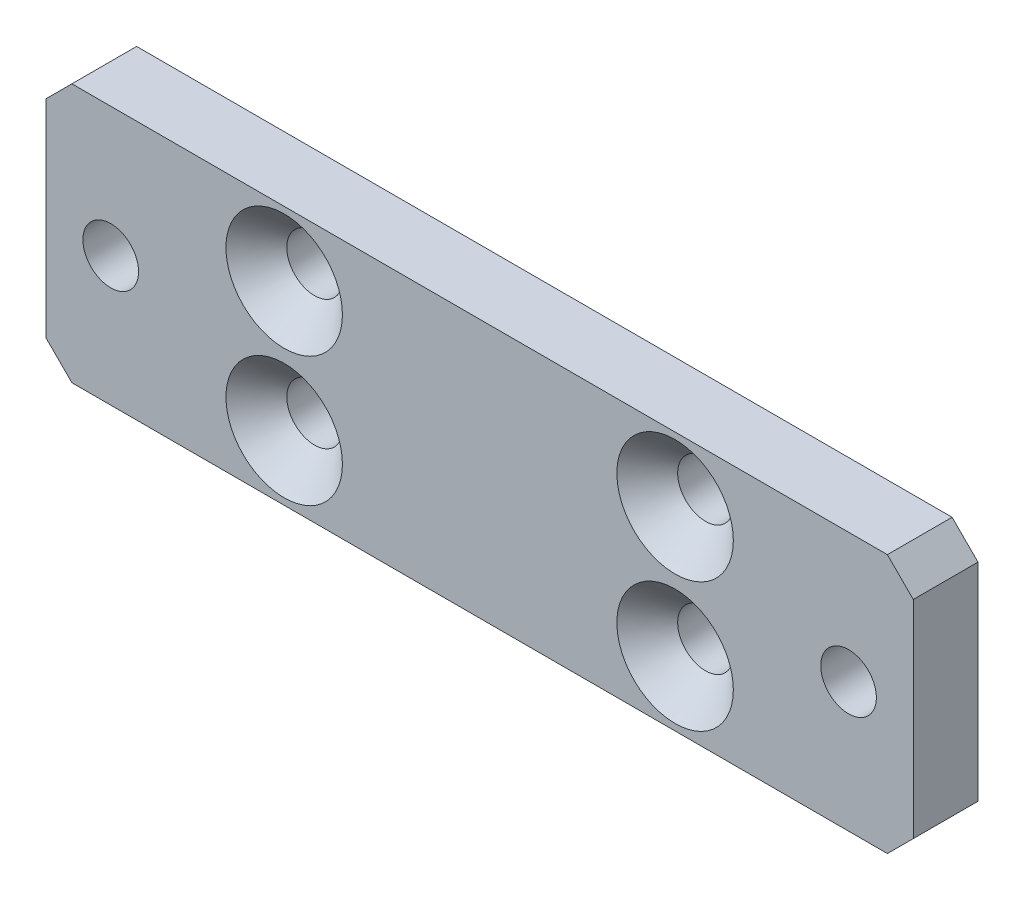
ISO-10303-21;
HEADER;
FILE_DESCRIPTION(('STEP AP214'),'2;1');
FILE_NAME('part.step','',(''),(''),'','','');
FILE_SCHEMA(('AUTOMOTIVE_DESIGN { 1 0 10303 214 1 1 1 1 }'));
ENDSEC;
DATA;
#1=APPLICATION_CONTEXT('core data for automotive mechanical design processes');
#2=APPLICATION_PROTOCOL_DEFINITION('international standard','automotive_design',2000,#1);
#3=PRODUCT_CONTEXT('',#1,'mechanical');
#4=PRODUCT('Part','Part','',(#3));
#5=PRODUCT_RELATED_PRODUCT_CATEGORY('part','',(#4));
#6=PRODUCT_DEFINITION_FORMATION('','',#4);
#7=PRODUCT_DEFINITION_CONTEXT('part definition',#1,'design');
#8=PRODUCT_DEFINITION('design','',#6,#7);
#9=PRODUCT_DEFINITION_SHAPE('','',#8);
#10=(LENGTH_UNIT() NAMED_UNIT(*) SI_UNIT(.MILLI.,.METRE.));
#11=(NAMED_UNIT(*) PLANE_ANGLE_UNIT() SI_UNIT($,.RADIAN.));
#12=(NAMED_UNIT(*) SI_UNIT($,.STERADIAN.) SOLID_ANGLE_UNIT());
#13=UNCERTAINTY_MEASURE_WITH_UNIT(LENGTH_MEASURE(1.E-05),#10,'distance_accuracy_value','');
#14=(GEOMETRIC_REPRESENTATION_CONTEXT(3) GLOBAL_UNCERTAINTY_ASSIGNED_CONTEXT((#13)) GLOBAL_UNIT_ASSIGNED_CONTEXT((#10,
#11,#12)) REPRESENTATION_CONTEXT('',''));
#15=CARTESIAN_POINT('',(0.,0.,0.));
#16=DIRECTION('',(0.,0.,1.));
#17=DIRECTION('',(1.,0.,0.));
#18=AXIS2_PLACEMENT_3D('',#15,#16,#17);
#19=CARTESIAN_POINT('',(-33.5,-10.,2.5));
#20=DIRECTION('',(1.,0.,0.));
#21=DIRECTION('',(0.,1.,0.));
#22=AXIS2_PLACEMENT_3D('',#19,#20,#21);
#23=PLANE('',#22);
#24=DIRECTION('',(0.,-1.,0.));
#25=VECTOR('',#24,1.);
#26=CARTESIAN_POINT('',(-33.5,-10.,-2.5));
#27=LINE('',#26,#25);
#28=CARTESIAN_POINT('',(-33.5,7.99999999999999,-2.5));
#29=VERTEX_POINT('',#28);
#30=CARTESIAN_POINT('',(-33.5,-8.00000000000001,-2.5));
#31=VERTEX_POINT('',#30);
#32=EDGE_CURVE('E169',#29,#31,#27,.T.);
#33=ORIENTED_EDGE('',*,*,#32,.T.);
#34=DIRECTION('',(0.,0.,1.));
#35=VECTOR('',#34,1.);
#36=CARTESIAN_POINT('',(-33.5,-8.00000000000001,2.5));
#37=LINE('',#36,#35);
#38=CARTESIAN_POINT('',(-33.5,-8.00000000000001,2.5));
#39=VERTEX_POINT('',#38);
#40=EDGE_CURVE('E144',#31,#39,#37,.T.);
#41=ORIENTED_EDGE('',*,*,#40,.T.);
#42=DIRECTION('',(0.,-1.,0.));
#43=VECTOR('',#42,1.);
#44=CARTESIAN_POINT('',(-33.5,-10.,2.5));
#45=LINE('',#44,#43);
#46=CARTESIAN_POINT('',(-33.5,7.99999999999999,2.5));
#47=VERTEX_POINT('',#46);
#48=EDGE_CURVE('E184',#47,#39,#45,.T.);
#49=ORIENTED_EDGE('',*,*,#48,.F.);
#50=DIRECTION('',(0.,0.,-1.));
#51=VECTOR('',#50,1.);
#52=CARTESIAN_POINT('',(-33.5,7.99999999999999,2.5));
#53=LINE('',#52,#51);
#54=EDGE_CURVE('E150',#47,#29,#53,.T.);
#55=ORIENTED_EDGE('',*,*,#54,.T.);
#56=EDGE_LOOP('',(#33,#41,#49,#55));
#57=FACE_BOUND('',#56,.T.);
#58=ADVANCED_FACE('F56',(#57),#23,.F.);
#59=CARTESIAN_POINT('',(33.5,-10.,2.5));
#60=DIRECTION('',(0.,1.,0.));
#61=DIRECTION('',(-1.,0.,0.));
#62=AXIS2_PLACEMENT_3D('',#59,#60,#61);
#63=PLANE('',#62);
#64=DIRECTION('',(1.,0.,0.));
#65=VECTOR('',#64,1.);
#66=CARTESIAN_POINT('',(33.5,-10.,2.5));
#67=LINE('',#66,#65);
#68=CARTESIAN_POINT('',(-31.5,-10.,2.5));
#69=VERTEX_POINT('',#68);
#70=CARTESIAN_POINT('',(31.5,-10.,2.5));
#71=VERTEX_POINT('',#70);
#72=EDGE_CURVE('E160',#69,#71,#67,.T.);
#73=ORIENTED_EDGE('',*,*,#72,.F.);
#74=DIRECTION('',(0.,0.,-1.));
#75=VECTOR('',#74,1.);
#76=CARTESIAN_POINT('',(-31.5,-10.,2.5));
#77=LINE('',#76,#75);
#78=CARTESIAN_POINT('',(-31.5,-10.,-2.5));
#79=VERTEX_POINT('',#78);
#80=EDGE_CURVE('E143',#69,#79,#77,.T.);
#81=ORIENTED_EDGE('',*,*,#80,.T.);
#82=DIRECTION('',(1.,0.,0.));
#83=VECTOR('',#82,1.);
#84=CARTESIAN_POINT('',(33.5,-10.,-2.5));
#85=LINE('',#84,#83);
#86=CARTESIAN_POINT('',(31.5,-10.,-2.5));
#87=VERTEX_POINT('',#86);
#88=EDGE_CURVE('E157',#79,#87,#85,.T.);
#89=ORIENTED_EDGE('',*,*,#88,.T.);
#90=DIRECTION('',(0.,0.,1.));
#91=VECTOR('',#90,1.);
#92=CARTESIAN_POINT('',(31.5,-10.,2.5));
#93=LINE('',#92,#91);
#94=EDGE_CURVE('E163',#87,#71,#93,.T.);
#95=ORIENTED_EDGE('',*,*,#94,.T.);
#96=EDGE_LOOP('',(#73,#81,#89,#95));
#97=FACE_BOUND('',#96,.T.);
#98=ADVANCED_FACE('F156',(#97),#63,.F.);
#99=CARTESIAN_POINT('',(33.5,-10.,2.5));
#100=DIRECTION('',(-1.,0.,0.));
#101=DIRECTION('',(0.,0.,1.));
#102=AXIS2_PLACEMENT_3D('',#99,#100,#101);
#103=PLANE('',#102);
#104=DIRECTION('',(0.,1.,0.));
#105=VECTOR('',#104,1.);
#106=CARTESIAN_POINT('',(33.5,-10.,2.5));
#107=LINE('',#106,#105);
#108=CARTESIAN_POINT('',(33.5,-7.99999999999999,2.5));
#109=VERTEX_POINT('',#108);
#110=CARTESIAN_POINT('',(33.5,8.00000000000001,2.5));
#111=VERTEX_POINT('',#110);
#112=EDGE_CURVE('E276',#109,#111,#107,.T.);
#113=ORIENTED_EDGE('',*,*,#112,.F.);
#114=DIRECTION('',(0.,0.,-1.));
#115=VECTOR('',#114,1.);
#116=CARTESIAN_POINT('',(33.5,-7.99999999999999,2.5));
#117=LINE('',#116,#115);
#118=CARTESIAN_POINT('',(33.5,-7.99999999999999,-2.5));
#119=VERTEX_POINT('',#118);
#120=EDGE_CURVE('E214',#109,#119,#117,.T.);
#121=ORIENTED_EDGE('',*,*,#120,.T.);
#122=DIRECTION('',(0.,1.,0.));
#123=VECTOR('',#122,1.);
#124=CARTESIAN_POINT('',(33.5,-10.,-2.5));
#125=LINE('',#124,#123);
#126=CARTESIAN_POINT('',(33.5,8.00000000000001,-2.5));
#127=VERTEX_POINT('',#126);
#128=EDGE_CURVE('E168',#119,#127,#125,.T.);
#129=ORIENTED_EDGE('',*,*,#128,.T.);
#130=DIRECTION('',(0.,0.,1.));
#131=VECTOR('',#130,1.);
#132=CARTESIAN_POINT('',(33.5,8.00000000000001,2.5));
#133=LINE('',#132,#131);
#134=EDGE_CURVE('E211',#127,#111,#133,.T.);
#135=ORIENTED_EDGE('',*,*,#134,.T.);
#136=EDGE_LOOP('',(#113,#121,#129,#135));
#137=FACE_BOUND('',#136,.T.);
#138=ADVANCED_FACE('F357',(#137),#103,.F.);
#139=CARTESIAN_POINT('',(33.5,10.,2.5));
#140=DIRECTION('',(0.,-1.,0.));
#141=DIRECTION('',(1.,0.,0.));
#142=AXIS2_PLACEMENT_3D('',#139,#140,#141);
#143=PLANE('',#142);
#144=DIRECTION('',(-1.,0.,0.));
#145=VECTOR('',#144,1.);
#146=CARTESIAN_POINT('',(33.5,10.,2.5));
#147=LINE('',#146,#145);
#148=CARTESIAN_POINT('',(31.5,10.,2.5));
#149=VERTEX_POINT('',#148);
#150=CARTESIAN_POINT('',(-31.5,9.99999999999999,2.5));
#151=VERTEX_POINT('',#150);
#152=EDGE_CURVE('E186',#149,#151,#147,.T.);
#153=ORIENTED_EDGE('',*,*,#152,.F.);
#154=DIRECTION('',(0.,0.,-1.));
#155=VECTOR('',#154,1.);
#156=CARTESIAN_POINT('',(31.5,10.,2.5));
#157=LINE('',#156,#155);
#158=CARTESIAN_POINT('',(31.5,10.,-2.5));
#159=VERTEX_POINT('',#158);
#160=EDGE_CURVE('E13',#149,#159,#157,.T.);
#161=ORIENTED_EDGE('',*,*,#160,.T.);
#162=DIRECTION('',(-1.,0.,0.));
#163=VECTOR('',#162,1.);
#164=CARTESIAN_POINT('',(33.5,10.,-2.5));
#165=LINE('',#164,#163);
#166=CARTESIAN_POINT('',(-31.5,9.99999999999999,-2.5));
#167=VERTEX_POINT('',#166);
#168=EDGE_CURVE('E176',#159,#167,#165,.T.);
#169=ORIENTED_EDGE('',*,*,#168,.T.);
#170=DIRECTION('',(0.,0.,1.));
#171=VECTOR('',#170,1.);
#172=CARTESIAN_POINT('',(-31.5,9.99999999999999,2.5));
#173=LINE('',#172,#171);
#174=EDGE_CURVE('E65',#167,#151,#173,.T.);
#175=ORIENTED_EDGE('',*,*,#174,.T.);
#176=EDGE_LOOP('',(#153,#161,#169,#175));
#177=FACE_BOUND('',#176,.T.);
#178=ADVANCED_FACE('F342',(#177),#143,.F.);
#179=CARTESIAN_POINT('',(0.,0.,2.5));
#180=DIRECTION('',(0.,0.,1.));
#181=DIRECTION('',(1.,0.,0.));
#182=AXIS2_PLACEMENT_3D('',#179,#180,#181);
#183=PLANE('',#182);
#184=CARTESIAN_POINT('',(-15.1,-5.,2.5));
#185=DIRECTION('',(0.,0.,1.));
#186=DIRECTION('',(1.,0.,0.));
#187=AXIS2_PLACEMENT_3D('',#184,#185,#186);
#188=CIRCLE('',#187,4.5);
#189=CARTESIAN_POINT('',(-10.6,-5.,2.5));
#190=VERTEX_POINT('',#189);
#191=EDGE_CURVE('E289',#190,#190,#188,.T.);
#192=ORIENTED_EDGE('',*,*,#191,.F.);
#193=EDGE_LOOP('',(#192));
#194=FACE_BOUND('',#193,.T.);
#195=CARTESIAN_POINT('',(-15.1,5.,2.5));
#196=DIRECTION('',(0.,0.,1.));
#197=DIRECTION('',(1.,0.,0.));
#198=AXIS2_PLACEMENT_3D('',#195,#196,#197);
#199=CIRCLE('',#198,4.5);
#200=CARTESIAN_POINT('',(-10.6,5.,2.5));
#201=VERTEX_POINT('',#200);
#202=EDGE_CURVE('E260',#201,#201,#199,.T.);
#203=ORIENTED_EDGE('',*,*,#202,.F.);
#204=EDGE_LOOP('',(#203));
#205=FACE_BOUND('',#204,.T.);
#206=CARTESIAN_POINT('',(15.1,5.,2.5));
#207=DIRECTION('',(0.,0.,1.));
#208=DIRECTION('',(1.,0.,0.));
#209=AXIS2_PLACEMENT_3D('',#206,#207,#208);
#210=CIRCLE('',#209,4.5);
#211=CARTESIAN_POINT('',(19.6,5.,2.5));
#212=VERTEX_POINT('',#211);
#213=EDGE_CURVE('E273',#212,#212,#210,.T.);
#214=ORIENTED_EDGE('',*,*,#213,.F.);
#215=EDGE_LOOP('',(#214));
#216=FACE_BOUND('',#215,.T.);
#217=CARTESIAN_POINT('',(15.1,-5.,2.5));
#218=DIRECTION('',(0.,0.,1.));
#219=DIRECTION('',(1.,0.,0.));
#220=AXIS2_PLACEMENT_3D('',#217,#218,#219);
#221=CIRCLE('',#220,4.5);
#222=CARTESIAN_POINT('',(19.6,-5.,2.5));
#223=VERTEX_POINT('',#222);
#224=EDGE_CURVE('E232',#223,#223,#221,.T.);
#225=ORIENTED_EDGE('',*,*,#224,.F.);
#226=EDGE_LOOP('',(#225));
#227=FACE_BOUND('',#226,.T.);
#228=CARTESIAN_POINT('',(-28.5,0.,2.5));
#229=DIRECTION('',(0.,0.,1.));
#230=DIRECTION('',(1.,0.,0.));
#231=AXIS2_PLACEMENT_3D('',#228,#229,#230);
#232=CIRCLE('',#231,2.14999999999999);
#233=CARTESIAN_POINT('',(-26.35,0.,2.5));
#234=VERTEX_POINT('',#233);
#235=EDGE_CURVE('E251',#234,#234,#232,.T.);
#236=ORIENTED_EDGE('',*,*,#235,.F.);
#237=EDGE_LOOP('',(#236));
#238=FACE_BOUND('',#237,.T.);
#239=CARTESIAN_POINT('',(28.5,0.,2.5));
#240=DIRECTION('',(0.,0.,1.));
#241=DIRECTION('',(1.,0.,0.));
#242=AXIS2_PLACEMENT_3D('',#239,#240,#241);
#243=CIRCLE('',#242,2.14999999999999);
#244=CARTESIAN_POINT('',(30.65,0.,2.5));
#245=VERTEX_POINT('',#244);
#246=EDGE_CURVE('E250',#245,#245,#243,.T.);
#247=ORIENTED_EDGE('',*,*,#246,.F.);
#248=EDGE_LOOP('',(#247));
#249=FACE_BOUND('',#248,.T.);
#250=ORIENTED_EDGE('',*,*,#48,.T.);
#251=DIRECTION('',(-0.707106781186548,0.707106781186548,0.));
#252=VECTOR('',#251,1.);
#253=CARTESIAN_POINT('',(-20.75,-20.75,2.5));
#254=LINE('',#253,#252);
#255=EDGE_CURVE('E208',#39,#69,#254,.F.);
#256=ORIENTED_EDGE('',*,*,#255,.T.);
#257=ORIENTED_EDGE('',*,*,#72,.T.);
#258=DIRECTION('',(-0.707106781186549,-0.707106781186546,0.));
#259=VECTOR('',#258,1.);
#260=CARTESIAN_POINT('',(20.7499999999999,-20.75,2.5));
#261=LINE('',#260,#259);
#262=EDGE_CURVE('E205',#71,#109,#261,.F.);
#263=ORIENTED_EDGE('',*,*,#262,.T.);
#264=ORIENTED_EDGE('',*,*,#112,.T.);
#265=DIRECTION('',(0.707106781186548,-0.707106781186548,0.));
#266=VECTOR('',#265,1.);
#267=CARTESIAN_POINT('',(20.75,20.75,2.5));
#268=LINE('',#267,#266);
#269=EDGE_CURVE('E84',#111,#149,#268,.F.);
#270=ORIENTED_EDGE('',*,*,#269,.T.);
#271=ORIENTED_EDGE('',*,*,#152,.T.);
#272=DIRECTION('',(0.707106781186549,0.707106781186546,0.));
#273=VECTOR('',#272,1.);
#274=CARTESIAN_POINT('',(-20.7499999999999,20.75,2.5));
#275=LINE('',#274,#273);
#276=EDGE_CURVE('E200',#151,#47,#275,.F.);
#277=ORIENTED_EDGE('',*,*,#276,.T.);
#278=EDGE_LOOP('',(#250,#256,#257,#263,#264,#270,#271,#277));
#279=FACE_BOUND('',#278,.T.);
#280=ADVANCED_FACE('F340',(#194,#205,#216,#227,#238,#249,#279),#183,.T.);
#281=CARTESIAN_POINT('',(0.,0.,-2.5));
#282=DIRECTION('',(0.,0.,1.));
#283=DIRECTION('',(1.,0.,0.));
#284=AXIS2_PLACEMENT_3D('',#281,#282,#283);
#285=PLANE('',#284);
#286=CARTESIAN_POINT('',(-15.1,-5.,-2.5));
#287=DIRECTION('',(0.,0.,1.));
#288=DIRECTION('',(1.,0.,0.));
#289=AXIS2_PLACEMENT_3D('',#286,#287,#288);
#290=CIRCLE('',#289,2.15);
#291=CARTESIAN_POINT('',(-12.95,-5.,-2.5));
#292=VERTEX_POINT('',#291);
#293=EDGE_CURVE('E288',#292,#292,#290,.T.);
#294=ORIENTED_EDGE('',*,*,#293,.T.);
#295=EDGE_LOOP('',(#294));
#296=FACE_BOUND('',#295,.T.);
#297=CARTESIAN_POINT('',(-15.1,5.,-2.5));
#298=DIRECTION('',(0.,0.,1.));
#299=DIRECTION('',(1.,0.,0.));
#300=AXIS2_PLACEMENT_3D('',#297,#298,#299);
#301=CIRCLE('',#300,2.15);
#302=CARTESIAN_POINT('',(-12.95,5.,-2.5));
#303=VERTEX_POINT('',#302);
#304=EDGE_CURVE('E259',#303,#303,#301,.T.);
#305=ORIENTED_EDGE('',*,*,#304,.T.);
#306=EDGE_LOOP('',(#305));
#307=FACE_BOUND('',#306,.T.);
#308=CARTESIAN_POINT('',(15.1,5.,-2.5));
#309=DIRECTION('',(0.,0.,1.));
#310=DIRECTION('',(1.,0.,0.));
#311=AXIS2_PLACEMENT_3D('',#308,#309,#310);
#312=CIRCLE('',#311,2.15);
#313=CARTESIAN_POINT('',(17.25,5.,-2.5));
#314=VERTEX_POINT('',#313);
#315=EDGE_CURVE('E229',#314,#314,#312,.T.);
#316=ORIENTED_EDGE('',*,*,#315,.T.);
#317=EDGE_LOOP('',(#316));
#318=FACE_BOUND('',#317,.T.);
#319=CARTESIAN_POINT('',(15.1,-5.,-2.5));
#320=DIRECTION('',(0.,0.,1.));
#321=DIRECTION('',(1.,0.,0.));
#322=AXIS2_PLACEMENT_3D('',#319,#320,#321);
#323=CIRCLE('',#322,2.15);
#324=CARTESIAN_POINT('',(17.25,-5.,-2.5));
#325=VERTEX_POINT('',#324);
#326=EDGE_CURVE('E293',#325,#325,#323,.T.);
#327=ORIENTED_EDGE('',*,*,#326,.T.);
#328=EDGE_LOOP('',(#327));
#329=FACE_BOUND('',#328,.T.);
#330=CARTESIAN_POINT('',(-28.5,0.,-2.5));
#331=DIRECTION('',(0.,0.,1.));
#332=DIRECTION('',(1.,0.,0.));
#333=AXIS2_PLACEMENT_3D('',#330,#331,#332);
#334=CIRCLE('',#333,2.15);
#335=CARTESIAN_POINT('',(-26.35,0.,-2.5));
#336=VERTEX_POINT('',#335);
#337=EDGE_CURVE('E246',#336,#336,#334,.T.);
#338=ORIENTED_EDGE('',*,*,#337,.T.);
#339=EDGE_LOOP('',(#338));
#340=FACE_BOUND('',#339,.T.);
#341=CARTESIAN_POINT('',(28.5,0.,-2.5));
#342=DIRECTION('',(0.,0.,1.));
#343=DIRECTION('',(1.,0.,0.));
#344=AXIS2_PLACEMENT_3D('',#341,#342,#343);
#345=CIRCLE('',#344,2.15);
#346=CARTESIAN_POINT('',(30.65,0.,-2.5));
#347=VERTEX_POINT('',#346);
#348=EDGE_CURVE('E179',#347,#347,#345,.T.);
#349=ORIENTED_EDGE('',*,*,#348,.T.);
#350=EDGE_LOOP('',(#349));
#351=FACE_BOUND('',#350,.T.);
#352=ORIENTED_EDGE('',*,*,#88,.F.);
#353=DIRECTION('',(0.707106781186548,-0.707106781186548,0.));
#354=VECTOR('',#353,1.);
#355=CARTESIAN_POINT('',(-31.5,-10.,-2.5));
#356=LINE('',#355,#354);
#357=EDGE_CURVE('E139',#79,#31,#356,.F.);
#358=ORIENTED_EDGE('',*,*,#357,.T.);
#359=ORIENTED_EDGE('',*,*,#32,.F.);
#360=DIRECTION('',(-0.707106781186549,-0.707106781186546,0.));
#361=VECTOR('',#360,1.);
#362=CARTESIAN_POINT('',(-33.5,7.99999999999999,-2.5));
#363=LINE('',#362,#361);
#364=EDGE_CURVE('E162',#29,#167,#363,.F.);
#365=ORIENTED_EDGE('',*,*,#364,.T.);
#366=ORIENTED_EDGE('',*,*,#168,.F.);
#367=DIRECTION('',(-0.707106781186548,0.707106781186548,0.));
#368=VECTOR('',#367,1.);
#369=CARTESIAN_POINT('',(31.5,10.,-2.5));
#370=LINE('',#369,#368);
#371=EDGE_CURVE('E190',#159,#127,#370,.F.);
#372=ORIENTED_EDGE('',*,*,#371,.T.);
#373=ORIENTED_EDGE('',*,*,#128,.F.);
#374=DIRECTION('',(0.707106781186549,0.707106781186546,0.));
#375=VECTOR('',#374,1.);
#376=CARTESIAN_POINT('',(33.5,-7.99999999999999,-2.5));
#377=LINE('',#376,#375);
#378=EDGE_CURVE('E151',#119,#87,#377,.F.);
#379=ORIENTED_EDGE('',*,*,#378,.T.);
#380=EDGE_LOOP('',(#352,#358,#359,#365,#366,#372,#373,#379));
#381=FACE_BOUND('',#380,.T.);
#382=ADVANCED_FACE('F165',(#296,#307,#318,#329,#340,#351,#381),#285,.F.);
#383=CARTESIAN_POINT('',(28.5,0.,2.5));
#384=DIRECTION('',(0.,0.,1.));
#385=DIRECTION('',(1.,0.,0.));
#386=AXIS2_PLACEMENT_3D('',#383,#384,#385);
#387=CYLINDRICAL_SURFACE('',#386,2.14999999999999);
#388=ORIENTED_EDGE('',*,*,#348,.F.);
#389=EDGE_LOOP('',(#388));
#390=FACE_BOUND('',#389,.T.);
#391=ORIENTED_EDGE('',*,*,#246,.T.);
#392=EDGE_LOOP('',(#391));
#393=FACE_BOUND('',#392,.T.);
#394=ADVANCED_FACE('F333',(#390,#393),#387,.F.);
#395=CARTESIAN_POINT('',(-28.5,0.,2.5));
#396=DIRECTION('',(0.,0.,1.));
#397=DIRECTION('',(1.,0.,0.));
#398=AXIS2_PLACEMENT_3D('',#395,#396,#397);
#399=CYLINDRICAL_SURFACE('',#398,2.14999999999999);
#400=ORIENTED_EDGE('',*,*,#337,.F.);
#401=EDGE_LOOP('',(#400));
#402=FACE_BOUND('',#401,.T.);
#403=ORIENTED_EDGE('',*,*,#235,.T.);
#404=EDGE_LOOP('',(#403));
#405=FACE_BOUND('',#404,.T.);
#406=ADVANCED_FACE('F336',(#402,#405),#399,.F.);
#407=CARTESIAN_POINT('',(15.1,-5.,2.5));
#408=DIRECTION('',(0.,0.,1.));
#409=DIRECTION('',(1.,0.,0.));
#410=AXIS2_PLACEMENT_3D('',#407,#408,#409);
#411=CYLINDRICAL_SURFACE('',#410,2.15);
#412=ORIENTED_EDGE('',*,*,#326,.F.);
#413=EDGE_LOOP('',(#412));
#414=FACE_BOUND('',#413,.T.);
#415=CARTESIAN_POINT('',(15.1,-5.,0.150000000000001));
#416=DIRECTION('',(0.,0.,1.));
#417=DIRECTION('',(1.,0.,0.));
#418=AXIS2_PLACEMENT_3D('',#415,#416,#417);
#419=CIRCLE('',#418,2.15);
#420=CARTESIAN_POINT('',(17.25,-5.,0.150000000000001));
#421=VERTEX_POINT('',#420);
#422=EDGE_CURVE('E296',#421,#421,#419,.T.);
#423=ORIENTED_EDGE('',*,*,#422,.T.);
#424=EDGE_LOOP('',(#423));
#425=FACE_BOUND('',#424,.T.);
#426=ADVANCED_FACE('F385',(#414,#425),#411,.F.);
#427=CARTESIAN_POINT('',(15.1,-5.,2.5));
#428=DIRECTION('',(0.,0.,1.));
#429=DIRECTION('',(1.,0.,0.));
#430=AXIS2_PLACEMENT_3D('',#427,#428,#429);
#431=CONICAL_SURFACE('',#430,4.5,0.785398163397449);
#432=ORIENTED_EDGE('',*,*,#422,.F.);
#433=EDGE_LOOP('',(#432));
#434=FACE_BOUND('',#433,.T.);
#435=ORIENTED_EDGE('',*,*,#224,.T.);
#436=EDGE_LOOP('',(#435));
#437=FACE_BOUND('',#436,.T.);
#438=ADVANCED_FACE('F389',(#434,#437),#431,.F.);
#439=CARTESIAN_POINT('',(15.1,5.,2.5));
#440=DIRECTION('',(0.,0.,1.));
#441=DIRECTION('',(1.,0.,0.));
#442=AXIS2_PLACEMENT_3D('',#439,#440,#441);
#443=CYLINDRICAL_SURFACE('',#442,2.15);
#444=ORIENTED_EDGE('',*,*,#315,.F.);
#445=EDGE_LOOP('',(#444));
#446=FACE_BOUND('',#445,.T.);
#447=CARTESIAN_POINT('',(15.1,5.,0.150000000000001));
#448=DIRECTION('',(0.,0.,1.));
#449=DIRECTION('',(1.,0.,0.));
#450=AXIS2_PLACEMENT_3D('',#447,#448,#449);
#451=CIRCLE('',#450,2.15);
#452=CARTESIAN_POINT('',(17.25,5.,0.150000000000001));
#453=VERTEX_POINT('',#452);
#454=EDGE_CURVE('E233',#453,#453,#451,.T.);
#455=ORIENTED_EDGE('',*,*,#454,.T.);
#456=EDGE_LOOP('',(#455));
#457=FACE_BOUND('',#456,.T.);
#458=ADVANCED_FACE('F393',(#446,#457),#443,.F.);
#459=CARTESIAN_POINT('',(15.1,5.,2.5));
#460=DIRECTION('',(0.,0.,1.));
#461=DIRECTION('',(1.,0.,0.));
#462=AXIS2_PLACEMENT_3D('',#459,#460,#461);
#463=CONICAL_SURFACE('',#462,4.5,0.785398163397449);
#464=ORIENTED_EDGE('',*,*,#454,.F.);
#465=EDGE_LOOP('',(#464));
#466=FACE_BOUND('',#465,.T.);
#467=ORIENTED_EDGE('',*,*,#213,.T.);
#468=EDGE_LOOP('',(#467));
#469=FACE_BOUND('',#468,.T.);
#470=ADVANCED_FACE('F397',(#466,#469),#463,.F.);
#471=CARTESIAN_POINT('',(-15.1,5.,2.5));
#472=DIRECTION('',(0.,0.,1.));
#473=DIRECTION('',(1.,0.,0.));
#474=AXIS2_PLACEMENT_3D('',#471,#472,#473);
#475=CYLINDRICAL_SURFACE('',#474,2.15);
#476=ORIENTED_EDGE('',*,*,#304,.F.);
#477=EDGE_LOOP('',(#476));
#478=FACE_BOUND('',#477,.T.);
#479=CARTESIAN_POINT('',(-15.1,5.,0.150000000000001));
#480=DIRECTION('',(0.,0.,1.));
#481=DIRECTION('',(1.,0.,0.));
#482=AXIS2_PLACEMENT_3D('',#479,#480,#481);
#483=CIRCLE('',#482,2.15);
#484=CARTESIAN_POINT('',(-12.95,5.,0.150000000000001));
#485=VERTEX_POINT('',#484);
#486=EDGE_CURVE('E255',#485,#485,#483,.T.);
#487=ORIENTED_EDGE('',*,*,#486,.T.);
#488=EDGE_LOOP('',(#487));
#489=FACE_BOUND('',#488,.T.);
#490=ADVANCED_FACE('F401',(#478,#489),#475,.F.);
#491=CARTESIAN_POINT('',(-15.1,5.,2.5));
#492=DIRECTION('',(0.,0.,1.));
#493=DIRECTION('',(1.,0.,0.));
#494=AXIS2_PLACEMENT_3D('',#491,#492,#493);
#495=CONICAL_SURFACE('',#494,4.5,0.785398163397449);
#496=ORIENTED_EDGE('',*,*,#486,.F.);
#497=EDGE_LOOP('',(#496));
#498=FACE_BOUND('',#497,.T.);
#499=ORIENTED_EDGE('',*,*,#202,.T.);
#500=EDGE_LOOP('',(#499));
#501=FACE_BOUND('',#500,.T.);
#502=ADVANCED_FACE('F405',(#498,#501),#495,.F.);
#503=CARTESIAN_POINT('',(-15.1,-5.,2.5));
#504=DIRECTION('',(0.,0.,1.));
#505=DIRECTION('',(1.,0.,0.));
#506=AXIS2_PLACEMENT_3D('',#503,#504,#505);
#507=CYLINDRICAL_SURFACE('',#506,2.15);
#508=ORIENTED_EDGE('',*,*,#293,.F.);
#509=EDGE_LOOP('',(#508));
#510=FACE_BOUND('',#509,.T.);
#511=CARTESIAN_POINT('',(-15.1,-5.,0.150000000000001));
#512=DIRECTION('',(0.,0.,1.));
#513=DIRECTION('',(1.,0.,0.));
#514=AXIS2_PLACEMENT_3D('',#511,#512,#513);
#515=CIRCLE('',#514,2.15);
#516=CARTESIAN_POINT('',(-12.95,-5.,0.150000000000001));
#517=VERTEX_POINT('',#516);
#518=EDGE_CURVE('E285',#517,#517,#515,.T.);
#519=ORIENTED_EDGE('',*,*,#518,.T.);
#520=EDGE_LOOP('',(#519));
#521=FACE_BOUND('',#520,.T.);
#522=ADVANCED_FACE('F409',(#510,#521),#507,.F.);
#523=CARTESIAN_POINT('',(-15.1,-5.,2.5));
#524=DIRECTION('',(0.,0.,1.));
#525=DIRECTION('',(1.,0.,0.));
#526=AXIS2_PLACEMENT_3D('',#523,#524,#525);
#527=CONICAL_SURFACE('',#526,4.5,0.785398163397449);
#528=ORIENTED_EDGE('',*,*,#518,.F.);
#529=EDGE_LOOP('',(#528));
#530=FACE_BOUND('',#529,.T.);
#531=ORIENTED_EDGE('',*,*,#191,.T.);
#532=EDGE_LOOP('',(#531));
#533=FACE_BOUND('',#532,.T.);
#534=ADVANCED_FACE('F368',(#530,#533),#527,.F.);
#535=CARTESIAN_POINT('',(-31.5,-10.,2.5));
#536=DIRECTION('',(0.707106781186548,0.707106781186548,0.));
#537=DIRECTION('',(0.,0.,-1.));
#538=AXIS2_PLACEMENT_3D('',#535,#536,#537);
#539=PLANE('',#538);
#540=ORIENTED_EDGE('',*,*,#255,.F.);
#541=ORIENTED_EDGE('',*,*,#40,.F.);
#542=ORIENTED_EDGE('',*,*,#357,.F.);
#543=ORIENTED_EDGE('',*,*,#80,.F.);
#544=EDGE_LOOP('',(#540,#541,#542,#543));
#545=FACE_BOUND('',#544,.T.);
#546=ADVANCED_FACE('F142',(#545),#539,.F.);
#547=CARTESIAN_POINT('',(33.5,-7.99999999999999,2.5));
#548=DIRECTION('',(-0.707106781186546,0.707106781186549,0.));
#549=DIRECTION('',(0.,0.,-1.));
#550=AXIS2_PLACEMENT_3D('',#547,#548,#549);
#551=PLANE('',#550);
#552=ORIENTED_EDGE('',*,*,#262,.F.);
#553=ORIENTED_EDGE('',*,*,#94,.F.);
#554=ORIENTED_EDGE('',*,*,#378,.F.);
#555=ORIENTED_EDGE('',*,*,#120,.F.);
#556=EDGE_LOOP('',(#552,#553,#554,#555));
#557=FACE_BOUND('',#556,.T.);
#558=ADVANCED_FACE('F361',(#557),#551,.F.);
#559=CARTESIAN_POINT('',(31.5,10.,2.5));
#560=DIRECTION('',(-0.707106781186548,-0.707106781186548,0.));
#561=DIRECTION('',(0.,0.,-1.));
#562=AXIS2_PLACEMENT_3D('',#559,#560,#561);
#563=PLANE('',#562);
#564=ORIENTED_EDGE('',*,*,#269,.F.);
#565=ORIENTED_EDGE('',*,*,#134,.F.);
#566=ORIENTED_EDGE('',*,*,#371,.F.);
#567=ORIENTED_EDGE('',*,*,#160,.F.);
#568=EDGE_LOOP('',(#564,#565,#566,#567));
#569=FACE_BOUND('',#568,.T.);
#570=ADVANCED_FACE('F353',(#569),#563,.F.);
#571=CARTESIAN_POINT('',(-33.5,7.99999999999999,2.5));
#572=DIRECTION('',(0.707106781186546,-0.707106781186549,0.));
#573=DIRECTION('',(0.,0.,-1.));
#574=AXIS2_PLACEMENT_3D('',#571,#572,#573);
#575=PLANE('',#574);
#576=ORIENTED_EDGE('',*,*,#276,.F.);
#577=ORIENTED_EDGE('',*,*,#174,.F.);
#578=ORIENTED_EDGE('',*,*,#364,.F.);
#579=ORIENTED_EDGE('',*,*,#54,.F.);
#580=EDGE_LOOP('',(#576,#577,#578,#579));
#581=FACE_BOUND('',#580,.T.);
#582=ADVANCED_FACE('F58',(#581),#575,.F.);
#583=CLOSED_SHELL('',(#58,#98,#138,#178,#280,#382,#394,#406,#426,#438,#458,#470,#490,#502,#522,
#534,#546,#558,#570,#582));
#584=MANIFOLD_SOLID_BREP('B2',#583);
#585=ADVANCED_BREP_SHAPE_REPRESENTATION('',(#18,#584),#14);
#586=SHAPE_DEFINITION_REPRESENTATION(#9,#585);
ENDSEC;
END-ISO-10303-21;
